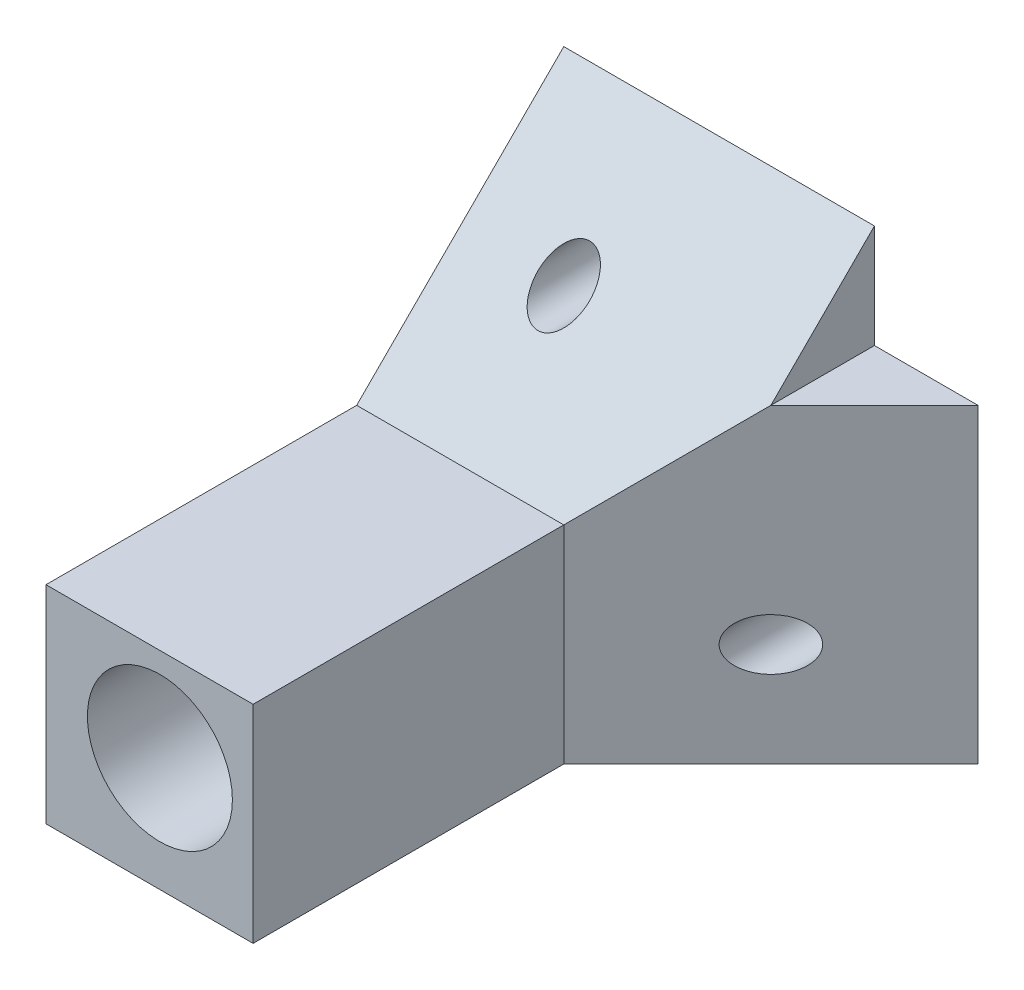
ISO-10303-21;
HEADER;
FILE_DESCRIPTION(('STEP AP214'),'2;1');
FILE_NAME('part.step','',(''),(''),'','','');
FILE_SCHEMA(('AUTOMOTIVE_DESIGN { 1 0 10303 214 1 1 1 1 }'));
ENDSEC;
DATA;
#1=APPLICATION_CONTEXT('core data for automotive mechanical design processes');
#2=APPLICATION_PROTOCOL_DEFINITION('international standard','automotive_design',2000,#1);
#3=PRODUCT_CONTEXT('',#1,'mechanical');
#4=PRODUCT('Part','Part','',(#3));
#5=PRODUCT_RELATED_PRODUCT_CATEGORY('part','',(#4));
#6=PRODUCT_DEFINITION_FORMATION('','',#4);
#7=PRODUCT_DEFINITION_CONTEXT('part definition',#1,'design');
#8=PRODUCT_DEFINITION('design','',#6,#7);
#9=PRODUCT_DEFINITION_SHAPE('','',#8);
#10=(LENGTH_UNIT() NAMED_UNIT(*) SI_UNIT(.MILLI.,.METRE.));
#11=(NAMED_UNIT(*) PLANE_ANGLE_UNIT() SI_UNIT($,.RADIAN.));
#12=(NAMED_UNIT(*) SI_UNIT($,.STERADIAN.) SOLID_ANGLE_UNIT());
#13=UNCERTAINTY_MEASURE_WITH_UNIT(LENGTH_MEASURE(1.E-05),#10,'distance_accuracy_value','');
#14=(GEOMETRIC_REPRESENTATION_CONTEXT(3) GLOBAL_UNCERTAINTY_ASSIGNED_CONTEXT((#13)) GLOBAL_UNIT_ASSIGNED_CONTEXT((#10,
#11,#12)) REPRESENTATION_CONTEXT('',''));
#15=CARTESIAN_POINT('',(0.,0.,0.));
#16=DIRECTION('',(0.,0.,1.));
#17=DIRECTION('',(1.,0.,0.));
#18=AXIS2_PLACEMENT_3D('',#15,#16,#17);
#19=CARTESIAN_POINT('',(14.9999999999999,20.0000000000001,15.));
#20=DIRECTION('',(0.,-0.707106781186547,-0.707106781186548));
#21=DIRECTION('',(0.,0.707106781186548,-0.707106781186547));
#22=AXIS2_PLACEMENT_3D('',#19,#20,#21);
#23=PLANE('',#22);
#24=CARTESIAN_POINT('',(4.99999999999995,15.,20.));
#25=DIRECTION('',(0.,-0.707106781186547,-0.707106781186548));
#26=DIRECTION('',(0.,0.707106781186548,-0.707106781186547));
#27=AXIS2_PLACEMENT_3D('',#24,#25,#26);
#28=ELLIPSE('',#27,1.76776695296637,1.25);
#29=CARTESIAN_POINT('',(4.99999999999994,16.25,18.75));
#30=VERTEX_POINT('',#29);
#31=EDGE_CURVE('E151',#30,#30,#28,.T.);
#32=ORIENTED_EDGE('',*,*,#31,.T.);
#33=EDGE_LOOP('',(#32));
#34=FACE_BOUND('',#33,.T.);
#35=DIRECTION('',(-1.,0.,0.));
#36=VECTOR('',#35,1.);
#37=CARTESIAN_POINT('',(-15.0000000000001,19.9999999999999,15.));
#38=LINE('',#37,#36);
#39=CARTESIAN_POINT('',(14.9999999999999,20.0000000000001,15.));
#40=VERTEX_POINT('',#39);
#41=CARTESIAN_POINT('',(0.,20.,15.));
#42=VERTEX_POINT('',#41);
#43=EDGE_CURVE('E156',#40,#42,#38,.T.);
#44=ORIENTED_EDGE('',*,*,#43,.T.);
#45=DIRECTION('',(0.,-0.707106781186548,0.707106781186547));
#46=VECTOR('',#45,1.);
#47=CARTESIAN_POINT('',(0.,20.,15.));
#48=LINE('',#47,#46);
#49=CARTESIAN_POINT('',(0.,10.,25.));
#50=VERTEX_POINT('',#49);
#51=EDGE_CURVE('E268',#42,#50,#48,.T.);
#52=ORIENTED_EDGE('',*,*,#51,.T.);
#53=DIRECTION('',(1.,0.,0.));
#54=VECTOR('',#53,1.);
#55=CARTESIAN_POINT('',(-15.,9.99999999999995,25.));
#56=LINE('',#55,#54);
#57=CARTESIAN_POINT('',(9.99999999999992,10.,25.));
#58=VERTEX_POINT('',#57);
#59=EDGE_CURVE('E155',#50,#58,#56,.T.);
#60=ORIENTED_EDGE('',*,*,#59,.T.);
#61=DIRECTION('',(-0.577350269189624,-0.577350269189628,0.577350269189626));
#62=VECTOR('',#61,1.);
#63=CARTESIAN_POINT('',(18.3333333333332,18.3333333333334,16.6666666666667));
#64=LINE('',#63,#62);
#65=CARTESIAN_POINT('',(15.,15.,20.0000000000001));
#66=VERTEX_POINT('',#65);
#67=EDGE_CURVE('E145',#66,#58,#64,.T.);
#68=ORIENTED_EDGE('',*,*,#67,.F.);
#69=DIRECTION('',(0.,-0.707106781186548,0.707106781186547));
#70=VECTOR('',#69,1.);
#71=CARTESIAN_POINT('',(14.9999999999999,20.0000000000001,15.));
#72=LINE('',#71,#70);
#73=EDGE_CURVE('E152',#40,#66,#72,.T.);
#74=ORIENTED_EDGE('',*,*,#73,.F.);
#75=EDGE_LOOP('',(#44,#52,#60,#68,#74));
#76=FACE_BOUND('',#75,.T.);
#77=ADVANCED_FACE('F41',(#34,#76),#23,.F.);
#78=CARTESIAN_POINT('',(14.9999999999999,20.0000000000001,15.));
#79=DIRECTION('',(-1.,0.,0.));
#80=DIRECTION('',(0.,-1.,0.));
#81=AXIS2_PLACEMENT_3D('',#78,#79,#80);
#82=PLANE('',#81);
#83=DIRECTION('',(0.,-1.,0.));
#84=VECTOR('',#83,1.);
#85=CARTESIAN_POINT('',(14.9999999999999,20.0000000000001,15.));
#86=LINE('',#85,#84);
#87=CARTESIAN_POINT('',(14.9999999999999,15.,15.));
#88=VERTEX_POINT('',#87);
#89=EDGE_CURVE('E159',#40,#88,#86,.T.);
#90=ORIENTED_EDGE('',*,*,#89,.F.);
#91=ORIENTED_EDGE('',*,*,#73,.T.);
#92=DIRECTION('',(0.,0.,-1.));
#93=VECTOR('',#92,1.);
#94=CARTESIAN_POINT('',(14.9999999999999,15.,15.));
#95=LINE('',#94,#93);
#96=EDGE_CURVE('E163',#66,#88,#95,.T.);
#97=ORIENTED_EDGE('',*,*,#96,.T.);
#98=EDGE_LOOP('',(#90,#91,#97));
#99=FACE_BOUND('',#98,.T.);
#100=ADVANCED_FACE('F224',(#99),#82,.F.);
#101=CARTESIAN_POINT('',(-10.,10.,40.));
#102=DIRECTION('',(0.,-1.,0.));
#103=DIRECTION('',(0.,0.,-1.));
#104=AXIS2_PLACEMENT_3D('',#101,#102,#103);
#105=PLANE('',#104);
#106=ORIENTED_EDGE('',*,*,#59,.F.);
#107=DIRECTION('',(0.,0.,1.));
#108=VECTOR('',#107,1.);
#109=CARTESIAN_POINT('',(0.,10.,40.));
#110=LINE('',#109,#108);
#111=CARTESIAN_POINT('',(0.,10.,40.));
#112=VERTEX_POINT('',#111);
#113=EDGE_CURVE('E265',#50,#112,#110,.T.);
#114=ORIENTED_EDGE('',*,*,#113,.T.);
#115=DIRECTION('',(-1.,0.,0.));
#116=VECTOR('',#115,1.);
#117=CARTESIAN_POINT('',(-10.,10.,40.));
#118=LINE('',#117,#116);
#119=CARTESIAN_POINT('',(10.,10.,40.));
#120=VERTEX_POINT('',#119);
#121=EDGE_CURVE('E126',#120,#112,#118,.T.);
#122=ORIENTED_EDGE('',*,*,#121,.F.);
#123=DIRECTION('',(0.,0.,-1.));
#124=VECTOR('',#123,1.);
#125=CARTESIAN_POINT('',(10.,10.,40.));
#126=LINE('',#125,#124);
#127=EDGE_CURVE('E198',#120,#58,#126,.T.);
#128=ORIENTED_EDGE('',*,*,#127,.T.);
#129=EDGE_LOOP('',(#106,#114,#122,#128));
#130=FACE_BOUND('',#129,.T.);
#131=ADVANCED_FACE('F228',(#130),#105,.F.);
#132=CARTESIAN_POINT('',(20.,15.,15.));
#133=DIRECTION('',(0.,-1.,0.));
#134=DIRECTION('',(1.,0.,0.));
#135=AXIS2_PLACEMENT_3D('',#132,#133,#134);
#136=PLANE('',#135);
#137=ORIENTED_EDGE('',*,*,#96,.F.);
#138=DIRECTION('',(-0.707106781186548,0.,0.707106781186547));
#139=VECTOR('',#138,1.);
#140=CARTESIAN_POINT('',(20.,15.,15.));
#141=LINE('',#140,#139);
#142=CARTESIAN_POINT('',(20.,15.,15.));
#143=VERTEX_POINT('',#142);
#144=EDGE_CURVE('E169',#143,#66,#141,.T.);
#145=ORIENTED_EDGE('',*,*,#144,.F.);
#146=DIRECTION('',(-1.,0.,0.));
#147=VECTOR('',#146,1.);
#148=CARTESIAN_POINT('',(20.,15.,15.));
#149=LINE('',#148,#147);
#150=EDGE_CURVE('E174',#143,#88,#149,.T.);
#151=ORIENTED_EDGE('',*,*,#150,.T.);
#152=EDGE_LOOP('',(#137,#145,#151));
#153=FACE_BOUND('',#152,.T.);
#154=ADVANCED_FACE('F235',(#153),#136,.F.);
#155=CARTESIAN_POINT('',(20.,-15.,15.));
#156=DIRECTION('',(-0.707106781186547,0.,-0.707106781186548));
#157=DIRECTION('',(-0.707106781186548,0.,0.707106781186547));
#158=AXIS2_PLACEMENT_3D('',#155,#156,#157);
#159=PLANE('',#158);
#160=CARTESIAN_POINT('',(15.,5.,20.));
#161=DIRECTION('',(-0.707106781186547,0.,-0.707106781186548));
#162=DIRECTION('',(0.707106781186548,0.,-0.707106781186547));
#163=AXIS2_PLACEMENT_3D('',#160,#161,#162);
#164=ELLIPSE('',#163,1.76776695296637,1.25);
#165=CARTESIAN_POINT('',(16.25,5.,18.75));
#166=VERTEX_POINT('',#165);
#167=EDGE_CURVE('E168',#166,#166,#164,.T.);
#168=ORIENTED_EDGE('',*,*,#167,.T.);
#169=EDGE_LOOP('',(#168));
#170=FACE_BOUND('',#169,.T.);
#171=DIRECTION('',(0.,-1.,0.));
#172=VECTOR('',#171,1.);
#173=CARTESIAN_POINT('',(10.,15.,25.));
#174=LINE('',#173,#172);
#175=CARTESIAN_POINT('',(10.,0.,25.));
#176=VERTEX_POINT('',#175);
#177=EDGE_CURVE('E49',#58,#176,#174,.T.);
#178=ORIENTED_EDGE('',*,*,#177,.T.);
#179=DIRECTION('',(0.707106781186548,0.,-0.707106781186547));
#180=VECTOR('',#179,1.);
#181=CARTESIAN_POINT('',(20.,0.,15.));
#182=LINE('',#181,#180);
#183=CARTESIAN_POINT('',(20.,0.,15.));
#184=VERTEX_POINT('',#183);
#185=EDGE_CURVE('E141',#176,#184,#182,.T.);
#186=ORIENTED_EDGE('',*,*,#185,.T.);
#187=DIRECTION('',(0.,1.,0.));
#188=VECTOR('',#187,1.);
#189=CARTESIAN_POINT('',(20.,15.,15.));
#190=LINE('',#189,#188);
#191=EDGE_CURVE('E172',#184,#143,#190,.T.);
#192=ORIENTED_EDGE('',*,*,#191,.T.);
#193=ORIENTED_EDGE('',*,*,#144,.T.);
#194=ORIENTED_EDGE('',*,*,#67,.T.);
#195=EDGE_LOOP('',(#178,#186,#192,#193,#194));
#196=FACE_BOUND('',#195,.T.);
#197=ADVANCED_FACE('F232',(#170,#196),#159,.F.);
#198=CARTESIAN_POINT('',(10.,10.,40.));
#199=DIRECTION('',(-1.,0.,0.));
#200=DIRECTION('',(0.,-1.,0.));
#201=AXIS2_PLACEMENT_3D('',#198,#199,#200);
#202=PLANE('',#201);
#203=DIRECTION('',(0.,1.,0.));
#204=VECTOR('',#203,1.);
#205=CARTESIAN_POINT('',(10.,10.,40.));
#206=LINE('',#205,#204);
#207=CARTESIAN_POINT('',(10.,0.,40.));
#208=VERTEX_POINT('',#207);
#209=EDGE_CURVE('E63',#208,#120,#206,.T.);
#210=ORIENTED_EDGE('',*,*,#209,.F.);
#211=DIRECTION('',(0.,0.,-1.));
#212=VECTOR('',#211,1.);
#213=CARTESIAN_POINT('',(10.,0.,40.));
#214=LINE('',#213,#212);
#215=EDGE_CURVE('E131',#208,#176,#214,.T.);
#216=ORIENTED_EDGE('',*,*,#215,.T.);
#217=ORIENTED_EDGE('',*,*,#177,.F.);
#218=ORIENTED_EDGE('',*,*,#127,.F.);
#219=EDGE_LOOP('',(#210,#216,#217,#218));
#220=FACE_BOUND('',#219,.T.);
#221=ADVANCED_FACE('F43',(#220),#202,.F.);
#222=CARTESIAN_POINT('',(2.92893218813453,0.,0.));
#223=DIRECTION('',(1.,0.,0.));
#224=DIRECTION('',(0.,0.,-1.));
#225=AXIS2_PLACEMENT_3D('',#222,#223,#224);
#226=PLANE('',#225);
#227=DIRECTION('',(0.,0.,1.));
#228=VECTOR('',#227,1.);
#229=CARTESIAN_POINT('',(2.92893218813453,0.,0.));
#230=LINE('',#229,#228);
#231=CARTESIAN_POINT('',(2.92893218813453,0.,10.));
#232=VERTEX_POINT('',#231);
#233=CARTESIAN_POINT('',(2.92893218813453,0.,15.));
#234=VERTEX_POINT('',#233);
#235=EDGE_CURVE('E132',#232,#234,#230,.T.);
#236=ORIENTED_EDGE('',*,*,#235,.F.);
#237=DIRECTION('',(0.,-1.,0.));
#238=VECTOR('',#237,1.);
#239=CARTESIAN_POINT('',(2.92893218813453,2.92893218813454,10.));
#240=LINE('',#239,#238);
#241=CARTESIAN_POINT('',(2.92893218813453,2.92893218813454,10.));
#242=VERTEX_POINT('',#241);
#243=EDGE_CURVE('E180',#242,#232,#240,.T.);
#244=ORIENTED_EDGE('',*,*,#243,.F.);
#245=DIRECTION('',(0.,0.,1.));
#246=VECTOR('',#245,1.);
#247=CARTESIAN_POINT('',(2.92893218813453,2.92893218813454,0.));
#248=LINE('',#247,#246);
#249=CARTESIAN_POINT('',(2.92893218813453,2.92893218813454,15.));
#250=VERTEX_POINT('',#249);
#251=EDGE_CURVE('E177',#242,#250,#248,.T.);
#252=ORIENTED_EDGE('',*,*,#251,.T.);
#253=DIRECTION('',(0.,-1.,0.));
#254=VECTOR('',#253,1.);
#255=CARTESIAN_POINT('',(2.92893218813453,7.5,15.));
#256=LINE('',#255,#254);
#257=EDGE_CURVE('E193',#250,#234,#256,.T.);
#258=ORIENTED_EDGE('',*,*,#257,.T.);
#259=EDGE_LOOP('',(#236,#244,#252,#258));
#260=FACE_BOUND('',#259,.T.);
#261=ADVANCED_FACE('F251',(#260),#226,.T.);
#262=CARTESIAN_POINT('',(0.,2.92893218813453,0.));
#263=DIRECTION('',(0.,1.,0.));
#264=DIRECTION('',(0.,0.,-1.));
#265=AXIS2_PLACEMENT_3D('',#262,#263,#264);
#266=PLANE('',#265);
#267=DIRECTION('',(0.,0.,-1.));
#268=VECTOR('',#267,1.);
#269=CARTESIAN_POINT('',(0.,2.92893218813453,0.));
#270=LINE('',#269,#268);
#271=CARTESIAN_POINT('',(0.,2.92893218813453,15.));
#272=VERTEX_POINT('',#271);
#273=CARTESIAN_POINT('',(0.,2.92893218813454,10.));
#274=VERTEX_POINT('',#273);
#275=EDGE_CURVE('E127',#272,#274,#270,.T.);
#276=ORIENTED_EDGE('',*,*,#275,.F.);
#277=DIRECTION('',(1.,0.,0.));
#278=VECTOR('',#277,1.);
#279=CARTESIAN_POINT('',(-7.50000000000001,2.9289321881345,15.));
#280=LINE('',#279,#278);
#281=EDGE_CURVE('E189',#272,#250,#280,.T.);
#282=ORIENTED_EDGE('',*,*,#281,.T.);
#283=ORIENTED_EDGE('',*,*,#251,.F.);
#284=DIRECTION('',(1.,0.,0.));
#285=VECTOR('',#284,1.);
#286=CARTESIAN_POINT('',(2.92893218813453,2.92893218813454,10.));
#287=LINE('',#286,#285);
#288=EDGE_CURVE('E183',#274,#242,#287,.T.);
#289=ORIENTED_EDGE('',*,*,#288,.F.);
#290=EDGE_LOOP('',(#276,#282,#283,#289));
#291=FACE_BOUND('',#290,.T.);
#292=ADVANCED_FACE('F248',(#291),#266,.T.);
#293=CARTESIAN_POINT('',(0.,0.,40.));
#294=DIRECTION('',(0.,0.,1.));
#295=DIRECTION('',(1.,0.,0.));
#296=AXIS2_PLACEMENT_3D('',#293,#294,#295);
#297=PLANE('',#296);
#298=DIRECTION('',(0.,1.,0.));
#299=VECTOR('',#298,1.);
#300=CARTESIAN_POINT('',(0.,0.,40.));
#301=LINE('',#300,#299);
#302=CARTESIAN_POINT('',(0.,0.,40.));
#303=VERTEX_POINT('',#302);
#304=EDGE_CURVE('E118',#303,#112,#301,.T.);
#305=ORIENTED_EDGE('',*,*,#304,.F.);
#306=DIRECTION('',(-1.,0.,0.));
#307=VECTOR('',#306,1.);
#308=CARTESIAN_POINT('',(0.,0.,40.));
#309=LINE('',#308,#307);
#310=EDGE_CURVE('E125',#208,#303,#309,.T.);
#311=ORIENTED_EDGE('',*,*,#310,.F.);
#312=ORIENTED_EDGE('',*,*,#209,.T.);
#313=ORIENTED_EDGE('',*,*,#121,.T.);
#314=EDGE_LOOP('',(#305,#311,#312,#313));
#315=FACE_BOUND('',#314,.T.);
#316=CARTESIAN_POINT('',(5.5,5.5,40.));
#317=DIRECTION('',(0.,0.,1.));
#318=DIRECTION('',(1.,0.,0.));
#319=AXIS2_PLACEMENT_3D('',#316,#317,#318);
#320=CIRCLE('',#319,3.5);
#321=CARTESIAN_POINT('',(9.,5.5,40.));
#322=VERTEX_POINT('',#321);
#323=EDGE_CURVE('E186',#322,#322,#320,.T.);
#324=ORIENTED_EDGE('',*,*,#323,.F.);
#325=EDGE_LOOP('',(#324));
#326=FACE_BOUND('',#325,.T.);
#327=ADVANCED_FACE('F123',(#315,#326),#297,.T.);
#328=CARTESIAN_POINT('',(2.92893218813453,7.5,15.));
#329=DIRECTION('',(0.,0.,1.));
#330=DIRECTION('',(0.,-1.,0.));
#331=AXIS2_PLACEMENT_3D('',#328,#329,#330);
#332=PLANE('',#331);
#333=CARTESIAN_POINT('',(4.99999999999995,15.,15.));
#334=DIRECTION('',(0.,0.,-1.));
#335=DIRECTION('',(-1.,0.,0.));
#336=AXIS2_PLACEMENT_3D('',#333,#334,#335);
#337=CIRCLE('',#336,1.25);
#338=CARTESIAN_POINT('',(3.74999999999995,15.,15.));
#339=VERTEX_POINT('',#338);
#340=EDGE_CURVE('E148',#339,#339,#337,.T.);
#341=ORIENTED_EDGE('',*,*,#340,.F.);
#342=EDGE_LOOP('',(#341));
#343=FACE_BOUND('',#342,.T.);
#344=CARTESIAN_POINT('',(15.,5.,15.));
#345=DIRECTION('',(0.,0.,-1.));
#346=DIRECTION('',(0.,1.,0.));
#347=AXIS2_PLACEMENT_3D('',#344,#345,#346);
#348=CIRCLE('',#347,1.25);
#349=CARTESIAN_POINT('',(15.,6.25,15.));
#350=VERTEX_POINT('',#349);
#351=EDGE_CURVE('E165',#350,#350,#348,.T.);
#352=ORIENTED_EDGE('',*,*,#351,.F.);
#353=EDGE_LOOP('',(#352));
#354=FACE_BOUND('',#353,.T.);
#355=CARTESIAN_POINT('',(5.5,5.5,15.));
#356=DIRECTION('',(0.,0.,1.));
#357=DIRECTION('',(1.,0.,0.));
#358=AXIS2_PLACEMENT_3D('',#355,#356,#357);
#359=CIRCLE('',#358,3.5);
#360=CARTESIAN_POINT('',(9.,5.5,15.));
#361=VERTEX_POINT('',#360);
#362=EDGE_CURVE('E185',#361,#361,#359,.T.);
#363=ORIENTED_EDGE('',*,*,#362,.T.);
#364=EDGE_LOOP('',(#363));
#365=FACE_BOUND('',#364,.T.);
#366=ORIENTED_EDGE('',*,*,#281,.F.);
#367=DIRECTION('',(0.,1.,0.));
#368=VECTOR('',#367,1.);
#369=CARTESIAN_POINT('',(0.,7.5,15.));
#370=LINE('',#369,#368);
#371=EDGE_CURVE('E136',#272,#42,#370,.T.);
#372=ORIENTED_EDGE('',*,*,#371,.T.);
#373=ORIENTED_EDGE('',*,*,#43,.F.);
#374=ORIENTED_EDGE('',*,*,#89,.T.);
#375=ORIENTED_EDGE('',*,*,#150,.F.);
#376=ORIENTED_EDGE('',*,*,#191,.F.);
#377=DIRECTION('',(-1.,0.,0.));
#378=VECTOR('',#377,1.);
#379=CARTESIAN_POINT('',(2.92893218813453,0.,15.));
#380=LINE('',#379,#378);
#381=EDGE_CURVE('E144',#184,#234,#380,.T.);
#382=ORIENTED_EDGE('',*,*,#381,.T.);
#383=ORIENTED_EDGE('',*,*,#257,.F.);
#384=EDGE_LOOP('',(#366,#372,#373,#374,#375,#376,#382,#383));
#385=FACE_BOUND('',#384,.T.);
#386=ADVANCED_FACE('F246',(#343,#354,#365,#385),#332,.F.);
#387=CARTESIAN_POINT('',(5.5,5.5,15.));
#388=DIRECTION('',(0.,0.,1.));
#389=DIRECTION('',(0.,-1.,0.));
#390=AXIS2_PLACEMENT_3D('',#387,#388,#389);
#391=CYLINDRICAL_SURFACE('',#390,3.5);
#392=ORIENTED_EDGE('',*,*,#362,.F.);
#393=EDGE_LOOP('',(#392));
#394=FACE_BOUND('',#393,.T.);
#395=ORIENTED_EDGE('',*,*,#323,.T.);
#396=EDGE_LOOP('',(#395));
#397=FACE_BOUND('',#396,.T.);
#398=ADVANCED_FACE('F242',(#394,#397),#391,.F.);
#399=CARTESIAN_POINT('',(0.,0.,10.));
#400=DIRECTION('',(0.,0.,-1.));
#401=DIRECTION('',(-1.,0.,0.));
#402=AXIS2_PLACEMENT_3D('',#399,#400,#401);
#403=PLANE('',#402);
#404=DIRECTION('',(0.,-1.,0.));
#405=VECTOR('',#404,1.);
#406=CARTESIAN_POINT('',(0.,0.,10.));
#407=LINE('',#406,#405);
#408=CARTESIAN_POINT('',(0.,0.,10.));
#409=VERTEX_POINT('',#408);
#410=EDGE_CURVE('E56',#274,#409,#407,.T.);
#411=ORIENTED_EDGE('',*,*,#410,.F.);
#412=ORIENTED_EDGE('',*,*,#288,.T.);
#413=ORIENTED_EDGE('',*,*,#243,.T.);
#414=DIRECTION('',(1.,0.,0.));
#415=VECTOR('',#414,1.);
#416=CARTESIAN_POINT('',(0.,0.,10.));
#417=LINE('',#416,#415);
#418=EDGE_CURVE('E133',#409,#232,#417,.T.);
#419=ORIENTED_EDGE('',*,*,#418,.F.);
#420=EDGE_LOOP('',(#411,#412,#413,#419));
#421=FACE_BOUND('',#420,.T.);
#422=ADVANCED_FACE('F219',(#421),#403,.T.);
#423=CARTESIAN_POINT('',(15.,5.,25.));
#424=DIRECTION('',(0.,0.,-1.));
#425=DIRECTION('',(0.,1.,0.));
#426=AXIS2_PLACEMENT_3D('',#423,#424,#425);
#427=CYLINDRICAL_SURFACE('',#426,1.25);
#428=ORIENTED_EDGE('',*,*,#351,.T.);
#429=EDGE_LOOP('',(#428));
#430=FACE_BOUND('',#429,.T.);
#431=ORIENTED_EDGE('',*,*,#167,.F.);
#432=EDGE_LOOP('',(#431));
#433=FACE_BOUND('',#432,.T.);
#434=ADVANCED_FACE('F211',(#430,#433),#427,.F.);
#435=CARTESIAN_POINT('',(4.99999999999995,15.,25.));
#436=DIRECTION('',(0.,0.,-1.));
#437=DIRECTION('',(-1.,0.,0.));
#438=AXIS2_PLACEMENT_3D('',#435,#436,#437);
#439=CYLINDRICAL_SURFACE('',#438,1.25);
#440=ORIENTED_EDGE('',*,*,#340,.T.);
#441=EDGE_LOOP('',(#440));
#442=FACE_BOUND('',#441,.T.);
#443=ORIENTED_EDGE('',*,*,#31,.F.);
#444=EDGE_LOOP('',(#443));
#445=FACE_BOUND('',#444,.T.);
#446=ADVANCED_FACE('F209',(#442,#445),#439,.F.);
#447=CARTESIAN_POINT('',(0.,0.,0.));
#448=DIRECTION('',(0.,1.,0.));
#449=DIRECTION('',(0.,0.,1.));
#450=AXIS2_PLACEMENT_3D('',#447,#448,#449);
#451=PLANE('',#450);
#452=ORIENTED_EDGE('',*,*,#310,.T.);
#453=DIRECTION('',(0.,0.,-1.));
#454=VECTOR('',#453,1.);
#455=CARTESIAN_POINT('',(0.,0.,0.));
#456=LINE('',#455,#454);
#457=EDGE_CURVE('E11',#303,#409,#456,.T.);
#458=ORIENTED_EDGE('',*,*,#457,.T.);
#459=ORIENTED_EDGE('',*,*,#418,.T.);
#460=ORIENTED_EDGE('',*,*,#235,.T.);
#461=ORIENTED_EDGE('',*,*,#381,.F.);
#462=ORIENTED_EDGE('',*,*,#185,.F.);
#463=ORIENTED_EDGE('',*,*,#215,.F.);
#464=EDGE_LOOP('',(#452,#458,#459,#460,#461,#462,#463));
#465=FACE_BOUND('',#464,.T.);
#466=ADVANCED_FACE('F129',(#465),#451,.F.);
#467=CARTESIAN_POINT('',(0.,0.,0.));
#468=DIRECTION('',(1.,0.,0.));
#469=DIRECTION('',(0.,0.,-1.));
#470=AXIS2_PLACEMENT_3D('',#467,#468,#469);
#471=PLANE('',#470);
#472=ORIENTED_EDGE('',*,*,#275,.T.);
#473=ORIENTED_EDGE('',*,*,#410,.T.);
#474=ORIENTED_EDGE('',*,*,#457,.F.);
#475=ORIENTED_EDGE('',*,*,#304,.T.);
#476=ORIENTED_EDGE('',*,*,#113,.F.);
#477=ORIENTED_EDGE('',*,*,#51,.F.);
#478=ORIENTED_EDGE('',*,*,#371,.F.);
#479=EDGE_LOOP('',(#472,#473,#474,#475,#476,#477,#478));
#480=FACE_BOUND('',#479,.T.);
#481=ADVANCED_FACE('F117',(#480),#471,.F.);
#482=CLOSED_SHELL('',(#77,#100,#131,#154,#197,#221,#261,#292,#327,#386,#398,#422,#434,#446,#466,#481));
#483=MANIFOLD_SOLID_BREP('B2',#482);
#484=ADVANCED_BREP_SHAPE_REPRESENTATION('',(#18,#483),#14);
#485=SHAPE_DEFINITION_REPRESENTATION(#9,#484);
ENDSEC;
END-ISO-10303-21;
